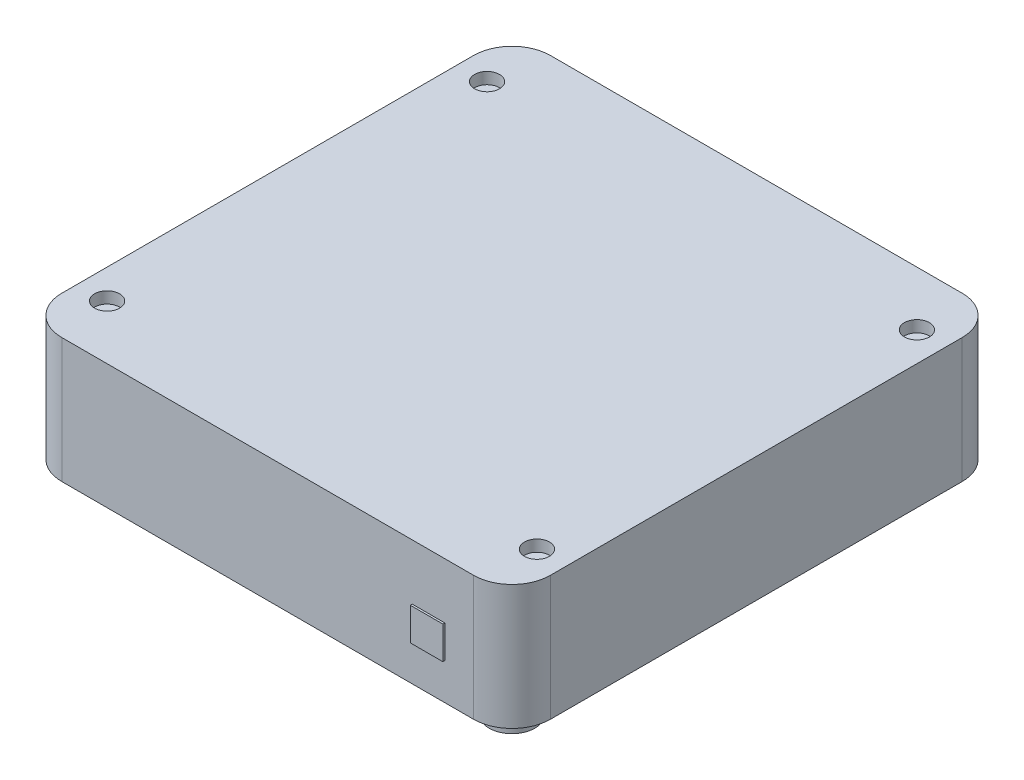
ISO-10303-21;
HEADER;
FILE_DESCRIPTION(('STEP AP214'),'2;1');
FILE_NAME('part.step','',(''),(''),'','','');
FILE_SCHEMA(('AUTOMOTIVE_DESIGN { 1 0 10303 214 1 1 1 1 }'));
ENDSEC;
DATA;
#1=APPLICATION_CONTEXT('core data for automotive mechanical design processes');
#2=APPLICATION_PROTOCOL_DEFINITION('international standard','automotive_design',2000,#1);
#3=PRODUCT_CONTEXT('',#1,'mechanical');
#4=PRODUCT('Part','Part','',(#3));
#5=PRODUCT_RELATED_PRODUCT_CATEGORY('part','',(#4));
#6=PRODUCT_DEFINITION_FORMATION('','',#4);
#7=PRODUCT_DEFINITION_CONTEXT('part definition',#1,'design');
#8=PRODUCT_DEFINITION('design','',#6,#7);
#9=PRODUCT_DEFINITION_SHAPE('','',#8);
#10=(LENGTH_UNIT() NAMED_UNIT(*) SI_UNIT(.MILLI.,.METRE.));
#11=(NAMED_UNIT(*) PLANE_ANGLE_UNIT() SI_UNIT($,.RADIAN.));
#12=(NAMED_UNIT(*) SI_UNIT($,.STERADIAN.) SOLID_ANGLE_UNIT());
#13=UNCERTAINTY_MEASURE_WITH_UNIT(LENGTH_MEASURE(1.E-05),#10,'distance_accuracy_value','');
#14=(GEOMETRIC_REPRESENTATION_CONTEXT(3) GLOBAL_UNCERTAINTY_ASSIGNED_CONTEXT((#13)) GLOBAL_UNIT_ASSIGNED_CONTEXT((#10,
#11,#12)) REPRESENTATION_CONTEXT('',''));
#15=CARTESIAN_POINT('',(0.,0.,0.));
#16=DIRECTION('',(0.,0.,1.));
#17=DIRECTION('',(1.,0.,0.));
#18=AXIS2_PLACEMENT_3D('',#15,#16,#17);
#19=CARTESIAN_POINT('',(-63.65,16.25,63.65));
#20=DIRECTION('',(0.,0.,-1.));
#21=DIRECTION('',(-1.,0.,0.));
#22=AXIS2_PLACEMENT_3D('',#19,#20,#21);
#23=PLANE('',#22);
#24=DIRECTION('',(1.,0.,0.));
#25=VECTOR('',#24,1.);
#26=CARTESIAN_POINT('',(-63.65,16.25,63.65));
#27=LINE('',#26,#25);
#28=CARTESIAN_POINT('',(-53.65,16.25,63.65));
#29=VERTEX_POINT('',#28);
#30=CARTESIAN_POINT('',(53.65,16.25,63.65));
#31=VERTEX_POINT('',#30);
#32=EDGE_CURVE('E186',#29,#31,#27,.T.);
#33=ORIENTED_EDGE('',*,*,#32,.F.);
#34=DIRECTION('',(0.,-1.,0.));
#35=VECTOR('',#34,1.);
#36=CARTESIAN_POINT('',(-53.65,16.25,63.65));
#37=LINE('',#36,#35);
#38=CARTESIAN_POINT('',(-53.65,-16.25,63.65));
#39=VERTEX_POINT('',#38);
#40=EDGE_CURVE('E223',#29,#39,#37,.T.);
#41=ORIENTED_EDGE('',*,*,#40,.T.);
#42=DIRECTION('',(1.,0.,0.));
#43=VECTOR('',#42,1.);
#44=CARTESIAN_POINT('',(-63.65,-16.25,63.65));
#45=LINE('',#44,#43);
#46=CARTESIAN_POINT('',(53.65,-16.25,63.65));
#47=VERTEX_POINT('',#46);
#48=EDGE_CURVE('E179',#39,#47,#45,.T.);
#49=ORIENTED_EDGE('',*,*,#48,.T.);
#50=DIRECTION('',(0.,-1.,0.));
#51=VECTOR('',#50,1.);
#52=CARTESIAN_POINT('',(53.65,16.25,63.65));
#53=LINE('',#52,#51);
#54=EDGE_CURVE('E220',#47,#31,#53,.F.);
#55=ORIENTED_EDGE('',*,*,#54,.T.);
#56=EDGE_LOOP('',(#33,#41,#49,#55));
#57=FACE_BOUND('',#56,.T.);
#58=DIRECTION('',(0.,-1.,0.));
#59=VECTOR('',#58,1.);
#60=CARTESIAN_POINT('',(37.65,16.25,63.65));
#61=LINE('',#60,#59);
#62=CARTESIAN_POINT('',(37.65,1.75,63.65));
#63=VERTEX_POINT('',#62);
#64=CARTESIAN_POINT('',(37.65,-6.75,63.65));
#65=VERTEX_POINT('',#64);
#66=EDGE_CURVE('E162',#63,#65,#61,.T.);
#67=ORIENTED_EDGE('',*,*,#66,.F.);
#68=DIRECTION('',(-1.,0.,0.));
#69=VECTOR('',#68,1.);
#70=CARTESIAN_POINT('',(-63.65,1.75,63.65));
#71=LINE('',#70,#69);
#72=CARTESIAN_POINT('',(46.15,1.75,63.65));
#73=VERTEX_POINT('',#72);
#74=EDGE_CURVE('E189',#73,#63,#71,.T.);
#75=ORIENTED_EDGE('',*,*,#74,.F.);
#76=DIRECTION('',(0.,1.,0.));
#77=VECTOR('',#76,1.);
#78=CARTESIAN_POINT('',(46.15,16.25,63.65));
#79=LINE('',#78,#77);
#80=CARTESIAN_POINT('',(46.15,-6.75,63.65));
#81=VERTEX_POINT('',#80);
#82=EDGE_CURVE('E203',#81,#73,#79,.T.);
#83=ORIENTED_EDGE('',*,*,#82,.F.);
#84=DIRECTION('',(1.,0.,0.));
#85=VECTOR('',#84,1.);
#86=CARTESIAN_POINT('',(-63.65,-6.75,63.65));
#87=LINE('',#86,#85);
#88=EDGE_CURVE('E207',#65,#81,#87,.T.);
#89=ORIENTED_EDGE('',*,*,#88,.F.);
#90=EDGE_LOOP('',(#67,#75,#83,#89));
#91=FACE_BOUND('',#90,.T.);
#92=ADVANCED_FACE('F45',(#57,#91),#23,.F.);
#93=CARTESIAN_POINT('',(63.65,16.25,-63.65));
#94=DIRECTION('',(-1.,0.,0.));
#95=DIRECTION('',(0.,0.,1.));
#96=AXIS2_PLACEMENT_3D('',#93,#94,#95);
#97=PLANE('',#96);
#98=DIRECTION('',(0.,0.,-1.));
#99=VECTOR('',#98,1.);
#100=CARTESIAN_POINT('',(63.65,-16.25,-63.65));
#101=LINE('',#100,#99);
#102=CARTESIAN_POINT('',(63.65,-16.25,53.65));
#103=VERTEX_POINT('',#102);
#104=CARTESIAN_POINT('',(63.65,-16.25,-53.65));
#105=VERTEX_POINT('',#104);
#106=EDGE_CURVE('E164',#103,#105,#101,.T.);
#107=ORIENTED_EDGE('',*,*,#106,.T.);
#108=DIRECTION('',(0.,-1.,0.));
#109=VECTOR('',#108,1.);
#110=CARTESIAN_POINT('',(63.65,16.25,-53.65));
#111=LINE('',#110,#109);
#112=CARTESIAN_POINT('',(63.65,16.25,-53.65));
#113=VERTEX_POINT('',#112);
#114=EDGE_CURVE('E11',#105,#113,#111,.F.);
#115=ORIENTED_EDGE('',*,*,#114,.T.);
#116=DIRECTION('',(0.,0.,-1.));
#117=VECTOR('',#116,1.);
#118=CARTESIAN_POINT('',(63.65,16.25,-63.65));
#119=LINE('',#118,#117);
#120=CARTESIAN_POINT('',(63.65,16.25,53.65));
#121=VERTEX_POINT('',#120);
#122=EDGE_CURVE('E175',#121,#113,#119,.T.);
#123=ORIENTED_EDGE('',*,*,#122,.F.);
#124=DIRECTION('',(0.,-1.,0.));
#125=VECTOR('',#124,1.);
#126=CARTESIAN_POINT('',(63.65,16.25,53.65));
#127=LINE('',#126,#125);
#128=EDGE_CURVE('E54',#121,#103,#127,.T.);
#129=ORIENTED_EDGE('',*,*,#128,.T.);
#130=EDGE_LOOP('',(#107,#115,#123,#129));
#131=FACE_BOUND('',#130,.T.);
#132=ADVANCED_FACE('F268',(#131),#97,.F.);
#133=CARTESIAN_POINT('',(-63.65,16.25,-63.65));
#134=DIRECTION('',(0.,0.,1.));
#135=DIRECTION('',(1.,0.,0.));
#136=AXIS2_PLACEMENT_3D('',#133,#134,#135);
#137=PLANE('',#136);
#138=DIRECTION('',(-1.,0.,0.));
#139=VECTOR('',#138,1.);
#140=CARTESIAN_POINT('',(-63.65,-16.25,-63.65));
#141=LINE('',#140,#139);
#142=CARTESIAN_POINT('',(53.65,-16.25,-63.65));
#143=VERTEX_POINT('',#142);
#144=CARTESIAN_POINT('',(-53.65,-16.25,-63.65));
#145=VERTEX_POINT('',#144);
#146=EDGE_CURVE('E169',#143,#145,#141,.T.);
#147=ORIENTED_EDGE('',*,*,#146,.T.);
#148=DIRECTION('',(0.,-1.,0.));
#149=VECTOR('',#148,1.);
#150=CARTESIAN_POINT('',(-53.65,16.25,-63.65));
#151=LINE('',#150,#149);
#152=CARTESIAN_POINT('',(-53.65,16.25,-63.65));
#153=VERTEX_POINT('',#152);
#154=EDGE_CURVE('E61',#145,#153,#151,.F.);
#155=ORIENTED_EDGE('',*,*,#154,.T.);
#156=DIRECTION('',(-1.,0.,0.));
#157=VECTOR('',#156,1.);
#158=CARTESIAN_POINT('',(-63.65,16.25,-63.65));
#159=LINE('',#158,#157);
#160=CARTESIAN_POINT('',(53.65,16.25,-63.65));
#161=VERTEX_POINT('',#160);
#162=EDGE_CURVE('E178',#161,#153,#159,.T.);
#163=ORIENTED_EDGE('',*,*,#162,.F.);
#164=DIRECTION('',(0.,-1.,0.));
#165=VECTOR('',#164,1.);
#166=CARTESIAN_POINT('',(53.65,16.25,-63.65));
#167=LINE('',#166,#165);
#168=EDGE_CURVE('E257',#161,#143,#167,.T.);
#169=ORIENTED_EDGE('',*,*,#168,.T.);
#170=EDGE_LOOP('',(#147,#155,#163,#169));
#171=FACE_BOUND('',#170,.T.);
#172=ADVANCED_FACE('F279',(#171),#137,.F.);
#173=CARTESIAN_POINT('',(-63.65,16.25,-63.65));
#174=DIRECTION('',(1.,0.,0.));
#175=DIRECTION('',(0.,0.,-1.));
#176=AXIS2_PLACEMENT_3D('',#173,#174,#175);
#177=PLANE('',#176);
#178=DIRECTION('',(0.,0.,1.));
#179=VECTOR('',#178,1.);
#180=CARTESIAN_POINT('',(-63.65,-16.25,-63.65));
#181=LINE('',#180,#179);
#182=CARTESIAN_POINT('',(-63.65,-16.25,-53.65));
#183=VERTEX_POINT('',#182);
#184=CARTESIAN_POINT('',(-63.65,-16.25,53.65));
#185=VERTEX_POINT('',#184);
#186=EDGE_CURVE('E193',#183,#185,#181,.T.);
#187=ORIENTED_EDGE('',*,*,#186,.T.);
#188=DIRECTION('',(0.,-1.,0.));
#189=VECTOR('',#188,1.);
#190=CARTESIAN_POINT('',(-63.65,16.25,53.65));
#191=LINE('',#190,#189);
#192=CARTESIAN_POINT('',(-63.65,16.25,53.65));
#193=VERTEX_POINT('',#192);
#194=EDGE_CURVE('E243',#185,#193,#191,.F.);
#195=ORIENTED_EDGE('',*,*,#194,.T.);
#196=DIRECTION('',(0.,0.,1.));
#197=VECTOR('',#196,1.);
#198=CARTESIAN_POINT('',(-63.65,16.25,-63.65));
#199=LINE('',#198,#197);
#200=CARTESIAN_POINT('',(-63.65,16.25,-53.65));
#201=VERTEX_POINT('',#200);
#202=EDGE_CURVE('E182',#201,#193,#199,.T.);
#203=ORIENTED_EDGE('',*,*,#202,.F.);
#204=DIRECTION('',(0.,-1.,0.));
#205=VECTOR('',#204,1.);
#206=CARTESIAN_POINT('',(-63.65,16.25,-53.65));
#207=LINE('',#206,#205);
#208=EDGE_CURVE('E239',#201,#183,#207,.T.);
#209=ORIENTED_EDGE('',*,*,#208,.T.);
#210=EDGE_LOOP('',(#187,#195,#203,#209));
#211=FACE_BOUND('',#210,.T.);
#212=ADVANCED_FACE('F288',(#211),#177,.F.);
#213=CARTESIAN_POINT('',(0.,16.25,0.));
#214=DIRECTION('',(0.,1.,0.));
#215=DIRECTION('',(0.,0.,1.));
#216=AXIS2_PLACEMENT_3D('',#213,#214,#215);
#217=PLANE('',#216);
#218=CARTESIAN_POINT('',(-56.,16.25,49.5));
#219=DIRECTION('',(0.,1.,0.));
#220=DIRECTION('',(0.,0.,-1.));
#221=AXIS2_PLACEMENT_3D('',#218,#219,#220);
#222=CIRCLE('',#221,3.25);
#223=CARTESIAN_POINT('',(-56.,16.25,46.25));
#224=VERTEX_POINT('',#223);
#225=EDGE_CURVE('E463',#224,#224,#222,.T.);
#226=ORIENTED_EDGE('',*,*,#225,.F.);
#227=EDGE_LOOP('',(#226));
#228=FACE_BOUND('',#227,.T.);
#229=CARTESIAN_POINT('',(56.,16.25,49.5));
#230=DIRECTION('',(0.,-1.,0.));
#231=DIRECTION('',(0.,0.,-1.));
#232=AXIS2_PLACEMENT_3D('',#229,#230,#231);
#233=CIRCLE('',#232,3.25);
#234=CARTESIAN_POINT('',(56.,16.25,46.25));
#235=VERTEX_POINT('',#234);
#236=EDGE_CURVE('E467',#235,#235,#233,.T.);
#237=ORIENTED_EDGE('',*,*,#236,.T.);
#238=EDGE_LOOP('',(#237));
#239=FACE_BOUND('',#238,.T.);
#240=CARTESIAN_POINT('',(-56.,16.25,-49.5));
#241=DIRECTION('',(0.,-1.,0.));
#242=DIRECTION('',(0.,0.,1.));
#243=AXIS2_PLACEMENT_3D('',#240,#241,#242);
#244=CIRCLE('',#243,3.25);
#245=CARTESIAN_POINT('',(-56.,16.25,-46.25));
#246=VERTEX_POINT('',#245);
#247=EDGE_CURVE('E471',#246,#246,#244,.T.);
#248=ORIENTED_EDGE('',*,*,#247,.T.);
#249=EDGE_LOOP('',(#248));
#250=FACE_BOUND('',#249,.T.);
#251=CARTESIAN_POINT('',(56.,16.25,-49.5));
#252=DIRECTION('',(0.,1.,0.));
#253=DIRECTION('',(0.,0.,1.));
#254=AXIS2_PLACEMENT_3D('',#251,#252,#253);
#255=CIRCLE('',#254,3.25);
#256=CARTESIAN_POINT('',(56.,16.25,-46.25));
#257=VERTEX_POINT('',#256);
#258=EDGE_CURVE('E474',#257,#257,#255,.T.);
#259=ORIENTED_EDGE('',*,*,#258,.F.);
#260=EDGE_LOOP('',(#259));
#261=FACE_BOUND('',#260,.T.);
#262=ORIENTED_EDGE('',*,*,#202,.T.);
#263=CARTESIAN_POINT('',(-53.65,16.25,53.65));
#264=DIRECTION('',(0.,1.,0.));
#265=DIRECTION('',(0.,0.,1.));
#266=AXIS2_PLACEMENT_3D('',#263,#264,#265);
#267=CIRCLE('',#266,10.);
#268=EDGE_CURVE('E254',#193,#29,#267,.T.);
#269=ORIENTED_EDGE('',*,*,#268,.T.);
#270=ORIENTED_EDGE('',*,*,#32,.T.);
#271=CARTESIAN_POINT('',(53.65,16.25,53.65));
#272=DIRECTION('',(0.,1.,0.));
#273=DIRECTION('',(0.,0.,1.));
#274=AXIS2_PLACEMENT_3D('',#271,#272,#273);
#275=CIRCLE('',#274,10.);
#276=EDGE_CURVE('E246',#31,#121,#275,.T.);
#277=ORIENTED_EDGE('',*,*,#276,.T.);
#278=ORIENTED_EDGE('',*,*,#122,.T.);
#279=CARTESIAN_POINT('',(53.65,16.25,-53.65));
#280=DIRECTION('',(0.,1.,0.));
#281=DIRECTION('',(0.,0.,1.));
#282=AXIS2_PLACEMENT_3D('',#279,#280,#281);
#283=CIRCLE('',#282,10.);
#284=EDGE_CURVE('E68',#113,#161,#283,.T.);
#285=ORIENTED_EDGE('',*,*,#284,.T.);
#286=ORIENTED_EDGE('',*,*,#162,.T.);
#287=CARTESIAN_POINT('',(-53.65,16.25,-53.65));
#288=DIRECTION('',(0.,1.,0.));
#289=DIRECTION('',(0.,0.,1.));
#290=AXIS2_PLACEMENT_3D('',#287,#288,#289);
#291=CIRCLE('',#290,10.);
#292=EDGE_CURVE('E251',#153,#201,#291,.T.);
#293=ORIENTED_EDGE('',*,*,#292,.T.);
#294=EDGE_LOOP('',(#262,#269,#270,#277,#278,#285,#286,#293));
#295=FACE_BOUND('',#294,.T.);
#296=ADVANCED_FACE('F281',(#228,#239,#250,#261,#295),#217,.T.);
#297=CARTESIAN_POINT('',(0.,-16.25,0.));
#298=DIRECTION('',(0.,1.,0.));
#299=DIRECTION('',(0.,0.,1.));
#300=AXIS2_PLACEMENT_3D('',#297,#298,#299);
#301=PLANE('',#300);
#302=CARTESIAN_POINT('',(-48.,-16.25,0.));
#303=DIRECTION('',(0.,-1.,0.));
#304=DIRECTION('',(0.,0.,-1.));
#305=AXIS2_PLACEMENT_3D('',#302,#303,#304);
#306=CIRCLE('',#305,1.6);
#307=CARTESIAN_POINT('',(-48.,-16.25,-1.6));
#308=VERTEX_POINT('',#307);
#309=EDGE_CURVE('E559',#308,#308,#306,.T.);
#310=ORIENTED_EDGE('',*,*,#309,.F.);
#311=EDGE_LOOP('',(#310));
#312=FACE_BOUND('',#311,.T.);
#313=CARTESIAN_POINT('',(48.,-16.25,0.));
#314=DIRECTION('',(0.,-1.,0.));
#315=DIRECTION('',(0.,0.,-1.));
#316=AXIS2_PLACEMENT_3D('',#313,#314,#315);
#317=CIRCLE('',#316,1.6);
#318=CARTESIAN_POINT('',(48.,-16.25,-1.59999999999998));
#319=VERTEX_POINT('',#318);
#320=EDGE_CURVE('E555',#319,#319,#317,.T.);
#321=ORIENTED_EDGE('',*,*,#320,.F.);
#322=EDGE_LOOP('',(#321));
#323=FACE_BOUND('',#322,.T.);
#324=CARTESIAN_POINT('',(-51.65,-16.25,-51.65));
#325=DIRECTION('',(0.,1.,0.));
#326=DIRECTION('',(0.,0.,1.));
#327=AXIS2_PLACEMENT_3D('',#324,#325,#326);
#328=CIRCLE('',#327,5.99999999999999);
#329=CARTESIAN_POINT('',(-51.65,-16.25,-45.65));
#330=VERTEX_POINT('',#329);
#331=EDGE_CURVE('E216',#330,#330,#328,.F.);
#332=ORIENTED_EDGE('',*,*,#331,.F.);
#333=EDGE_LOOP('',(#332));
#334=FACE_BOUND('',#333,.T.);
#335=CARTESIAN_POINT('',(-51.65,-16.25,51.65));
#336=DIRECTION('',(0.,1.,0.));
#337=DIRECTION('',(0.,0.,-1.));
#338=AXIS2_PLACEMENT_3D('',#335,#336,#337);
#339=CIRCLE('',#338,5.99999999999999);
#340=CARTESIAN_POINT('',(-51.65,-16.25,45.65));
#341=VERTEX_POINT('',#340);
#342=EDGE_CURVE('E492',#341,#341,#339,.T.);
#343=ORIENTED_EDGE('',*,*,#342,.T.);
#344=EDGE_LOOP('',(#343));
#345=FACE_BOUND('',#344,.T.);
#346=CARTESIAN_POINT('',(51.65,-16.25,-51.65));
#347=DIRECTION('',(0.,1.,0.));
#348=DIRECTION('',(0.,0.,1.));
#349=AXIS2_PLACEMENT_3D('',#346,#347,#348);
#350=CIRCLE('',#349,5.99999999999999);
#351=CARTESIAN_POINT('',(51.65,-16.25,-45.65));
#352=VERTEX_POINT('',#351);
#353=EDGE_CURVE('E497',#352,#352,#350,.T.);
#354=ORIENTED_EDGE('',*,*,#353,.T.);
#355=EDGE_LOOP('',(#354));
#356=FACE_BOUND('',#355,.T.);
#357=CARTESIAN_POINT('',(51.65,-16.25,51.65));
#358=DIRECTION('',(0.,1.,0.));
#359=DIRECTION('',(0.,0.,1.));
#360=AXIS2_PLACEMENT_3D('',#357,#358,#359);
#361=CIRCLE('',#360,5.99999999999999);
#362=CARTESIAN_POINT('',(51.65,-16.25,57.65));
#363=VERTEX_POINT('',#362);
#364=EDGE_CURVE('E212',#363,#363,#361,.F.);
#365=ORIENTED_EDGE('',*,*,#364,.F.);
#366=EDGE_LOOP('',(#365));
#367=FACE_BOUND('',#366,.T.);
#368=ORIENTED_EDGE('',*,*,#48,.F.);
#369=CARTESIAN_POINT('',(-53.65,-16.25,53.65));
#370=DIRECTION('',(0.,1.,0.));
#371=DIRECTION('',(0.,0.,1.));
#372=AXIS2_PLACEMENT_3D('',#369,#370,#371);
#373=CIRCLE('',#372,10.);
#374=EDGE_CURVE('E236',#39,#185,#373,.F.);
#375=ORIENTED_EDGE('',*,*,#374,.T.);
#376=ORIENTED_EDGE('',*,*,#186,.F.);
#377=CARTESIAN_POINT('',(-53.65,-16.25,-53.65));
#378=DIRECTION('',(0.,1.,0.));
#379=DIRECTION('',(0.,0.,1.));
#380=AXIS2_PLACEMENT_3D('',#377,#378,#379);
#381=CIRCLE('',#380,10.);
#382=EDGE_CURVE('E233',#183,#145,#381,.F.);
#383=ORIENTED_EDGE('',*,*,#382,.T.);
#384=ORIENTED_EDGE('',*,*,#146,.F.);
#385=CARTESIAN_POINT('',(53.65,-16.25,-53.65));
#386=DIRECTION('',(0.,1.,0.));
#387=DIRECTION('',(0.,0.,1.));
#388=AXIS2_PLACEMENT_3D('',#385,#386,#387);
#389=CIRCLE('',#388,10.);
#390=EDGE_CURVE('E230',#143,#105,#389,.F.);
#391=ORIENTED_EDGE('',*,*,#390,.T.);
#392=ORIENTED_EDGE('',*,*,#106,.F.);
#393=CARTESIAN_POINT('',(53.65,-16.25,53.65));
#394=DIRECTION('',(0.,1.,0.));
#395=DIRECTION('',(0.,0.,1.));
#396=AXIS2_PLACEMENT_3D('',#393,#394,#395);
#397=CIRCLE('',#396,10.);
#398=EDGE_CURVE('E227',#103,#47,#397,.F.);
#399=ORIENTED_EDGE('',*,*,#398,.T.);
#400=EDGE_LOOP('',(#368,#375,#376,#383,#384,#391,#392,#399));
#401=FACE_BOUND('',#400,.T.);
#402=ADVANCED_FACE('F274',(#312,#323,#334,#345,#356,#367,#401),#301,.F.);
#403=CARTESIAN_POINT('',(37.65,1.75,64.15));
#404=DIRECTION('',(1.,0.,0.));
#405=DIRECTION('',(0.,0.,-1.));
#406=AXIS2_PLACEMENT_3D('',#403,#404,#405);
#407=PLANE('',#406);
#408=DIRECTION('',(0.,0.,-1.));
#409=VECTOR('',#408,1.);
#410=CARTESIAN_POINT('',(37.65,1.75,64.15));
#411=LINE('',#410,#409);
#412=CARTESIAN_POINT('',(37.65,1.75,64.15));
#413=VERTEX_POINT('',#412);
#414=EDGE_CURVE('E515',#413,#63,#411,.T.);
#415=ORIENTED_EDGE('',*,*,#414,.T.);
#416=ORIENTED_EDGE('',*,*,#66,.T.);
#417=DIRECTION('',(0.,0.,-1.));
#418=VECTOR('',#417,1.);
#419=CARTESIAN_POINT('',(37.65,-6.75,64.15));
#420=LINE('',#419,#418);
#421=CARTESIAN_POINT('',(37.65,-6.75,64.15));
#422=VERTEX_POINT('',#421);
#423=EDGE_CURVE('E141',#422,#65,#420,.T.);
#424=ORIENTED_EDGE('',*,*,#423,.F.);
#425=DIRECTION('',(0.,-1.,0.));
#426=VECTOR('',#425,1.);
#427=CARTESIAN_POINT('',(37.65,1.75,64.15));
#428=LINE('',#427,#426);
#429=EDGE_CURVE('E148',#413,#422,#428,.T.);
#430=ORIENTED_EDGE('',*,*,#429,.F.);
#431=EDGE_LOOP('',(#415,#416,#424,#430));
#432=FACE_BOUND('',#431,.T.);
#433=ADVANCED_FACE('F161',(#432),#407,.F.);
#434=CARTESIAN_POINT('',(37.65,-6.75,64.15));
#435=DIRECTION('',(0.,1.,0.));
#436=DIRECTION('',(0.,0.,1.));
#437=AXIS2_PLACEMENT_3D('',#434,#435,#436);
#438=PLANE('',#437);
#439=ORIENTED_EDGE('',*,*,#423,.T.);
#440=ORIENTED_EDGE('',*,*,#88,.T.);
#441=DIRECTION('',(0.,0.,-1.));
#442=VECTOR('',#441,1.);
#443=CARTESIAN_POINT('',(46.15,-6.75,64.15));
#444=LINE('',#443,#442);
#445=CARTESIAN_POINT('',(46.15,-6.75,64.15));
#446=VERTEX_POINT('',#445);
#447=EDGE_CURVE('E143',#446,#81,#444,.T.);
#448=ORIENTED_EDGE('',*,*,#447,.F.);
#449=DIRECTION('',(1.,0.,0.));
#450=VECTOR('',#449,1.);
#451=CARTESIAN_POINT('',(37.65,-6.75,64.15));
#452=LINE('',#451,#450);
#453=EDGE_CURVE('E136',#422,#446,#452,.T.);
#454=ORIENTED_EDGE('',*,*,#453,.F.);
#455=EDGE_LOOP('',(#439,#440,#448,#454));
#456=FACE_BOUND('',#455,.T.);
#457=ADVANCED_FACE('F138',(#456),#438,.F.);
#458=CARTESIAN_POINT('',(46.15,1.75,64.15));
#459=DIRECTION('',(-1.,0.,0.));
#460=DIRECTION('',(0.,0.,1.));
#461=AXIS2_PLACEMENT_3D('',#458,#459,#460);
#462=PLANE('',#461);
#463=ORIENTED_EDGE('',*,*,#447,.T.);
#464=ORIENTED_EDGE('',*,*,#82,.T.);
#465=DIRECTION('',(0.,0.,-1.));
#466=VECTOR('',#465,1.);
#467=CARTESIAN_POINT('',(46.15,1.75,64.15));
#468=LINE('',#467,#466);
#469=CARTESIAN_POINT('',(46.15,1.75,64.15));
#470=VERTEX_POINT('',#469);
#471=EDGE_CURVE('E171',#470,#73,#468,.T.);
#472=ORIENTED_EDGE('',*,*,#471,.F.);
#473=DIRECTION('',(0.,1.,0.));
#474=VECTOR('',#473,1.);
#475=CARTESIAN_POINT('',(46.15,1.75,64.15));
#476=LINE('',#475,#474);
#477=EDGE_CURVE('E147',#446,#470,#476,.T.);
#478=ORIENTED_EDGE('',*,*,#477,.F.);
#479=EDGE_LOOP('',(#463,#464,#472,#478));
#480=FACE_BOUND('',#479,.T.);
#481=ADVANCED_FACE('F448',(#480),#462,.F.);
#482=CARTESIAN_POINT('',(37.65,1.75,64.15));
#483=DIRECTION('',(0.,-1.,0.));
#484=DIRECTION('',(0.,0.,-1.));
#485=AXIS2_PLACEMENT_3D('',#482,#483,#484);
#486=PLANE('',#485);
#487=ORIENTED_EDGE('',*,*,#471,.T.);
#488=ORIENTED_EDGE('',*,*,#74,.T.);
#489=ORIENTED_EDGE('',*,*,#414,.F.);
#490=DIRECTION('',(-1.,0.,0.));
#491=VECTOR('',#490,1.);
#492=CARTESIAN_POINT('',(37.65,1.75,64.15));
#493=LINE('',#492,#491);
#494=EDGE_CURVE('E153',#470,#413,#493,.T.);
#495=ORIENTED_EDGE('',*,*,#494,.F.);
#496=EDGE_LOOP('',(#487,#488,#489,#495));
#497=FACE_BOUND('',#496,.T.);
#498=ADVANCED_FACE('F445',(#497),#486,.F.);
#499=CARTESIAN_POINT('',(0.,0.,64.15));
#500=DIRECTION('',(0.,0.,1.));
#501=DIRECTION('',(1.,0.,0.));
#502=AXIS2_PLACEMENT_3D('',#499,#500,#501);
#503=PLANE('',#502);
#504=ORIENTED_EDGE('',*,*,#429,.T.);
#505=ORIENTED_EDGE('',*,*,#453,.T.);
#506=ORIENTED_EDGE('',*,*,#477,.T.);
#507=ORIENTED_EDGE('',*,*,#494,.T.);
#508=EDGE_LOOP('',(#504,#505,#506,#507));
#509=FACE_BOUND('',#508,.T.);
#510=ADVANCED_FACE('F151',(#509),#503,.T.);
#511=CARTESIAN_POINT('',(51.65,-22.25,51.65));
#512=DIRECTION('',(0.,1.,0.));
#513=DIRECTION('',(0.,0.,1.));
#514=AXIS2_PLACEMENT_3D('',#511,#512,#513);
#515=CYLINDRICAL_SURFACE('',#514,5.99999999999999);
#516=CARTESIAN_POINT('',(51.65,-22.25,51.65));
#517=DIRECTION('',(0.,-1.,0.));
#518=DIRECTION('',(0.,0.,-1.));
#519=AXIS2_PLACEMENT_3D('',#516,#517,#518);
#520=CIRCLE('',#519,5.99999999999999);
#521=CARTESIAN_POINT('',(51.65,-22.25,45.65));
#522=VERTEX_POINT('',#521);
#523=EDGE_CURVE('E158',#522,#522,#520,.T.);
#524=ORIENTED_EDGE('',*,*,#523,.F.);
#525=EDGE_LOOP('',(#524));
#526=FACE_BOUND('',#525,.T.);
#527=ORIENTED_EDGE('',*,*,#364,.T.);
#528=EDGE_LOOP('',(#527));
#529=FACE_BOUND('',#528,.T.);
#530=ADVANCED_FACE('F438',(#526,#529),#515,.T.);
#531=CARTESIAN_POINT('',(51.65,-22.25,51.65));
#532=DIRECTION('',(0.,-1.,0.));
#533=DIRECTION('',(0.,0.,-1.));
#534=AXIS2_PLACEMENT_3D('',#531,#532,#533);
#535=PLANE('',#534);
#536=ORIENTED_EDGE('',*,*,#523,.T.);
#537=EDGE_LOOP('',(#536));
#538=FACE_BOUND('',#537,.T.);
#539=ADVANCED_FACE('F434',(#538),#535,.T.);
#540=CARTESIAN_POINT('',(51.65,-22.25,-51.65));
#541=DIRECTION('',(0.,1.,0.));
#542=DIRECTION('',(0.,0.,1.));
#543=AXIS2_PLACEMENT_3D('',#540,#541,#542);
#544=CYLINDRICAL_SURFACE('',#543,5.99999999999999);
#545=CARTESIAN_POINT('',(51.65,-22.25,-51.65));
#546=DIRECTION('',(0.,1.,0.));
#547=DIRECTION('',(0.,0.,1.));
#548=AXIS2_PLACEMENT_3D('',#545,#546,#547);
#549=CIRCLE('',#548,5.99999999999999);
#550=CARTESIAN_POINT('',(51.65,-22.25,-45.65));
#551=VERTEX_POINT('',#550);
#552=EDGE_CURVE('E501',#551,#551,#549,.T.);
#553=ORIENTED_EDGE('',*,*,#552,.T.);
#554=EDGE_LOOP('',(#553));
#555=FACE_BOUND('',#554,.T.);
#556=ORIENTED_EDGE('',*,*,#353,.F.);
#557=EDGE_LOOP('',(#556));
#558=FACE_BOUND('',#557,.T.);
#559=ADVANCED_FACE('F430',(#555,#558),#544,.T.);
#560=CARTESIAN_POINT('',(51.65,-22.25,-51.65));
#561=DIRECTION('',(0.,-1.,0.));
#562=DIRECTION('',(0.,0.,1.));
#563=AXIS2_PLACEMENT_3D('',#560,#561,#562);
#564=PLANE('',#563);
#565=ORIENTED_EDGE('',*,*,#552,.F.);
#566=EDGE_LOOP('',(#565));
#567=FACE_BOUND('',#566,.T.);
#568=ADVANCED_FACE('F426',(#567),#564,.T.);
#569=CARTESIAN_POINT('',(-51.65,-22.25,51.65));
#570=DIRECTION('',(0.,1.,0.));
#571=DIRECTION('',(0.,0.,1.));
#572=AXIS2_PLACEMENT_3D('',#569,#570,#571);
#573=CYLINDRICAL_SURFACE('',#572,5.99999999999999);
#574=CARTESIAN_POINT('',(-51.65,-22.25,51.65));
#575=DIRECTION('',(0.,1.,0.));
#576=DIRECTION('',(0.,0.,-1.));
#577=AXIS2_PLACEMENT_3D('',#574,#575,#576);
#578=CIRCLE('',#577,5.99999999999999);
#579=CARTESIAN_POINT('',(-51.65,-22.25,45.65));
#580=VERTEX_POINT('',#579);
#581=EDGE_CURVE('E493',#580,#580,#578,.T.);
#582=ORIENTED_EDGE('',*,*,#581,.T.);
#583=EDGE_LOOP('',(#582));
#584=FACE_BOUND('',#583,.T.);
#585=ORIENTED_EDGE('',*,*,#342,.F.);
#586=EDGE_LOOP('',(#585));
#587=FACE_BOUND('',#586,.T.);
#588=ADVANCED_FACE('F422',(#584,#587),#573,.T.);
#589=CARTESIAN_POINT('',(-51.65,-22.25,51.65));
#590=DIRECTION('',(0.,-1.,0.));
#591=DIRECTION('',(0.,0.,-1.));
#592=AXIS2_PLACEMENT_3D('',#589,#590,#591);
#593=PLANE('',#592);
#594=ORIENTED_EDGE('',*,*,#581,.F.);
#595=EDGE_LOOP('',(#594));
#596=FACE_BOUND('',#595,.T.);
#597=ADVANCED_FACE('F418',(#596),#593,.T.);
#598=CARTESIAN_POINT('',(-51.65,-22.25,-51.65));
#599=DIRECTION('',(0.,1.,0.));
#600=DIRECTION('',(0.,0.,1.));
#601=AXIS2_PLACEMENT_3D('',#598,#599,#600);
#602=CYLINDRICAL_SURFACE('',#601,5.99999999999999);
#603=CARTESIAN_POINT('',(-51.65,-22.25,-51.65));
#604=DIRECTION('',(0.,-1.,0.));
#605=DIRECTION('',(0.,0.,1.));
#606=AXIS2_PLACEMENT_3D('',#603,#604,#605);
#607=CIRCLE('',#606,5.99999999999999);
#608=CARTESIAN_POINT('',(-51.65,-22.25,-45.65));
#609=VERTEX_POINT('',#608);
#610=EDGE_CURVE('E483',#609,#609,#607,.T.);
#611=ORIENTED_EDGE('',*,*,#610,.F.);
#612=EDGE_LOOP('',(#611));
#613=FACE_BOUND('',#612,.T.);
#614=ORIENTED_EDGE('',*,*,#331,.T.);
#615=EDGE_LOOP('',(#614));
#616=FACE_BOUND('',#615,.T.);
#617=ADVANCED_FACE('F414',(#613,#616),#602,.T.);
#618=CARTESIAN_POINT('',(-51.65,-22.25,-51.65));
#619=DIRECTION('',(0.,-1.,0.));
#620=DIRECTION('',(0.,0.,1.));
#621=AXIS2_PLACEMENT_3D('',#618,#619,#620);
#622=PLANE('',#621);
#623=ORIENTED_EDGE('',*,*,#610,.T.);
#624=EDGE_LOOP('',(#623));
#625=FACE_BOUND('',#624,.T.);
#626=ADVANCED_FACE('F410',(#625),#622,.T.);
#627=CARTESIAN_POINT('',(56.,13.25,-49.5));
#628=DIRECTION('',(0.,1.,0.));
#629=DIRECTION('',(0.,0.,1.));
#630=AXIS2_PLACEMENT_3D('',#627,#628,#629);
#631=CYLINDRICAL_SURFACE('',#630,3.25);
#632=CARTESIAN_POINT('',(56.,13.25,-49.5));
#633=DIRECTION('',(0.,1.,0.));
#634=DIRECTION('',(0.,0.,1.));
#635=AXIS2_PLACEMENT_3D('',#632,#633,#634);
#636=CIRCLE('',#635,3.25);
#637=CARTESIAN_POINT('',(56.,13.25,-46.25));
#638=VERTEX_POINT('',#637);
#639=EDGE_CURVE('E477',#638,#638,#636,.T.);
#640=ORIENTED_EDGE('',*,*,#639,.F.);
#641=EDGE_LOOP('',(#640));
#642=FACE_BOUND('',#641,.T.);
#643=ORIENTED_EDGE('',*,*,#258,.T.);
#644=EDGE_LOOP('',(#643));
#645=FACE_BOUND('',#644,.T.);
#646=ADVANCED_FACE('F406',(#642,#645),#631,.F.);
#647=CARTESIAN_POINT('',(56.,13.25,-49.5));
#648=DIRECTION('',(0.,1.,0.));
#649=DIRECTION('',(0.,0.,1.));
#650=AXIS2_PLACEMENT_3D('',#647,#648,#649);
#651=PLANE('',#650);
#652=ORIENTED_EDGE('',*,*,#639,.T.);
#653=EDGE_LOOP('',(#652));
#654=FACE_BOUND('',#653,.T.);
#655=ADVANCED_FACE('F402',(#654),#651,.T.);
#656=CARTESIAN_POINT('',(-56.,13.25,-49.5));
#657=DIRECTION('',(0.,1.,0.));
#658=DIRECTION('',(0.,0.,1.));
#659=AXIS2_PLACEMENT_3D('',#656,#657,#658);
#660=CYLINDRICAL_SURFACE('',#659,3.25);
#661=CARTESIAN_POINT('',(-56.,13.25,-49.5));
#662=DIRECTION('',(0.,-1.,0.));
#663=DIRECTION('',(0.,0.,1.));
#664=AXIS2_PLACEMENT_3D('',#661,#662,#663);
#665=CIRCLE('',#664,3.25);
#666=CARTESIAN_POINT('',(-56.,13.25,-46.25));
#667=VERTEX_POINT('',#666);
#668=EDGE_CURVE('E478',#667,#667,#665,.T.);
#669=ORIENTED_EDGE('',*,*,#668,.T.);
#670=EDGE_LOOP('',(#669));
#671=FACE_BOUND('',#670,.T.);
#672=ORIENTED_EDGE('',*,*,#247,.F.);
#673=EDGE_LOOP('',(#672));
#674=FACE_BOUND('',#673,.T.);
#675=ADVANCED_FACE('F398',(#671,#674),#660,.F.);
#676=CARTESIAN_POINT('',(-56.,13.25,-49.5));
#677=DIRECTION('',(0.,1.,0.));
#678=DIRECTION('',(0.,0.,1.));
#679=AXIS2_PLACEMENT_3D('',#676,#677,#678);
#680=PLANE('',#679);
#681=ORIENTED_EDGE('',*,*,#668,.F.);
#682=EDGE_LOOP('',(#681));
#683=FACE_BOUND('',#682,.T.);
#684=ADVANCED_FACE('F394',(#683),#680,.T.);
#685=CARTESIAN_POINT('',(56.,13.25,49.5));
#686=DIRECTION('',(0.,1.,0.));
#687=DIRECTION('',(0.,0.,1.));
#688=AXIS2_PLACEMENT_3D('',#685,#686,#687);
#689=CYLINDRICAL_SURFACE('',#688,3.25);
#690=CARTESIAN_POINT('',(56.,13.25,49.5));
#691=DIRECTION('',(0.,-1.,0.));
#692=DIRECTION('',(0.,0.,-1.));
#693=AXIS2_PLACEMENT_3D('',#690,#691,#692);
#694=CIRCLE('',#693,3.25);
#695=CARTESIAN_POINT('',(56.,13.25,46.25));
#696=VERTEX_POINT('',#695);
#697=EDGE_CURVE('E537',#696,#696,#694,.T.);
#698=ORIENTED_EDGE('',*,*,#697,.T.);
#699=EDGE_LOOP('',(#698));
#700=FACE_BOUND('',#699,.T.);
#701=ORIENTED_EDGE('',*,*,#236,.F.);
#702=EDGE_LOOP('',(#701));
#703=FACE_BOUND('',#702,.T.);
#704=ADVANCED_FACE('F390',(#700,#703),#689,.F.);
#705=CARTESIAN_POINT('',(56.,13.25,49.5));
#706=DIRECTION('',(0.,1.,0.));
#707=DIRECTION('',(0.,0.,-1.));
#708=AXIS2_PLACEMENT_3D('',#705,#706,#707);
#709=PLANE('',#708);
#710=ORIENTED_EDGE('',*,*,#697,.F.);
#711=EDGE_LOOP('',(#710));
#712=FACE_BOUND('',#711,.T.);
#713=ADVANCED_FACE('F386',(#712),#709,.T.);
#714=CARTESIAN_POINT('',(-56.,13.25,49.5));
#715=DIRECTION('',(0.,1.,0.));
#716=DIRECTION('',(0.,0.,1.));
#717=AXIS2_PLACEMENT_3D('',#714,#715,#716);
#718=CYLINDRICAL_SURFACE('',#717,3.25);
#719=CARTESIAN_POINT('',(-56.,13.25,49.5));
#720=DIRECTION('',(0.,1.,0.));
#721=DIRECTION('',(0.,0.,-1.));
#722=AXIS2_PLACEMENT_3D('',#719,#720,#721);
#723=CIRCLE('',#722,3.25);
#724=CARTESIAN_POINT('',(-56.,13.25,46.25));
#725=VERTEX_POINT('',#724);
#726=EDGE_CURVE('E541',#725,#725,#723,.T.);
#727=ORIENTED_EDGE('',*,*,#726,.F.);
#728=EDGE_LOOP('',(#727));
#729=FACE_BOUND('',#728,.T.);
#730=ORIENTED_EDGE('',*,*,#225,.T.);
#731=EDGE_LOOP('',(#730));
#732=FACE_BOUND('',#731,.T.);
#733=ADVANCED_FACE('F382',(#729,#732),#718,.F.);
#734=CARTESIAN_POINT('',(-56.,13.25,49.5));
#735=DIRECTION('',(0.,1.,0.));
#736=DIRECTION('',(0.,0.,-1.));
#737=AXIS2_PLACEMENT_3D('',#734,#735,#736);
#738=PLANE('',#737);
#739=ORIENTED_EDGE('',*,*,#726,.T.);
#740=EDGE_LOOP('',(#739));
#741=FACE_BOUND('',#740,.T.);
#742=ADVANCED_FACE('F324',(#741),#738,.T.);
#743=CARTESIAN_POINT('',(-53.65,16.25,53.65));
#744=DIRECTION('',(0.,-1.,0.));
#745=DIRECTION('',(0.,0.,-1.));
#746=AXIS2_PLACEMENT_3D('',#743,#744,#745);
#747=CYLINDRICAL_SURFACE('',#746,10.);
#748=ORIENTED_EDGE('',*,*,#268,.F.);
#749=ORIENTED_EDGE('',*,*,#194,.F.);
#750=ORIENTED_EDGE('',*,*,#374,.F.);
#751=ORIENTED_EDGE('',*,*,#40,.F.);
#752=EDGE_LOOP('',(#748,#749,#750,#751));
#753=FACE_BOUND('',#752,.T.);
#754=ADVANCED_FACE('F293',(#753),#747,.T.);
#755=CARTESIAN_POINT('',(-53.65,16.25,-53.65));
#756=DIRECTION('',(0.,-1.,0.));
#757=DIRECTION('',(0.,0.,-1.));
#758=AXIS2_PLACEMENT_3D('',#755,#756,#757);
#759=CYLINDRICAL_SURFACE('',#758,10.);
#760=ORIENTED_EDGE('',*,*,#292,.F.);
#761=ORIENTED_EDGE('',*,*,#154,.F.);
#762=ORIENTED_EDGE('',*,*,#382,.F.);
#763=ORIENTED_EDGE('',*,*,#208,.F.);
#764=EDGE_LOOP('',(#760,#761,#762,#763));
#765=FACE_BOUND('',#764,.T.);
#766=ADVANCED_FACE('F285',(#765),#759,.T.);
#767=CARTESIAN_POINT('',(53.65,16.25,-53.65));
#768=DIRECTION('',(0.,-1.,0.));
#769=DIRECTION('',(0.,0.,-1.));
#770=AXIS2_PLACEMENT_3D('',#767,#768,#769);
#771=CYLINDRICAL_SURFACE('',#770,10.);
#772=ORIENTED_EDGE('',*,*,#284,.F.);
#773=ORIENTED_EDGE('',*,*,#114,.F.);
#774=ORIENTED_EDGE('',*,*,#390,.F.);
#775=ORIENTED_EDGE('',*,*,#168,.F.);
#776=EDGE_LOOP('',(#772,#773,#774,#775));
#777=FACE_BOUND('',#776,.T.);
#778=ADVANCED_FACE('F278',(#777),#771,.T.);
#779=CARTESIAN_POINT('',(53.65,16.25,53.65));
#780=DIRECTION('',(0.,-1.,0.));
#781=DIRECTION('',(0.,0.,-1.));
#782=AXIS2_PLACEMENT_3D('',#779,#780,#781);
#783=CYLINDRICAL_SURFACE('',#782,10.);
#784=ORIENTED_EDGE('',*,*,#276,.F.);
#785=ORIENTED_EDGE('',*,*,#54,.F.);
#786=ORIENTED_EDGE('',*,*,#398,.F.);
#787=ORIENTED_EDGE('',*,*,#128,.F.);
#788=EDGE_LOOP('',(#784,#785,#786,#787));
#789=FACE_BOUND('',#788,.T.);
#790=ADVANCED_FACE('F47',(#789),#783,.T.);
#791=CARTESIAN_POINT('',(48.,-13.25,0.));
#792=DIRECTION('',(0.,-1.,0.));
#793=DIRECTION('',(0.,0.,-1.));
#794=AXIS2_PLACEMENT_3D('',#791,#792,#793);
#795=CYLINDRICAL_SURFACE('',#794,1.6);
#796=CARTESIAN_POINT('',(48.,-13.25,0.));
#797=DIRECTION('',(0.,-1.,0.));
#798=DIRECTION('',(0.,0.,-1.));
#799=AXIS2_PLACEMENT_3D('',#796,#797,#798);
#800=CIRCLE('',#799,1.6);
#801=CARTESIAN_POINT('',(48.,-13.25,-1.59999999999998));
#802=VERTEX_POINT('',#801);
#803=EDGE_CURVE('E551',#802,#802,#800,.T.);
#804=ORIENTED_EDGE('',*,*,#803,.F.);
#805=EDGE_LOOP('',(#804));
#806=FACE_BOUND('',#805,.T.);
#807=ORIENTED_EDGE('',*,*,#320,.T.);
#808=EDGE_LOOP('',(#807));
#809=FACE_BOUND('',#808,.T.);
#810=ADVANCED_FACE('F299',(#806,#809),#795,.F.);
#811=CARTESIAN_POINT('',(48.,-13.25,0.));
#812=DIRECTION('',(0.,-1.,0.));
#813=DIRECTION('',(0.,0.,-1.));
#814=AXIS2_PLACEMENT_3D('',#811,#812,#813);
#815=PLANE('',#814);
#816=ORIENTED_EDGE('',*,*,#803,.T.);
#817=EDGE_LOOP('',(#816));
#818=FACE_BOUND('',#817,.T.);
#819=ADVANCED_FACE('F305',(#818),#815,.T.);
#820=CARTESIAN_POINT('',(-48.,-13.25,0.));
#821=DIRECTION('',(0.,-1.,0.));
#822=DIRECTION('',(0.,0.,-1.));
#823=AXIS2_PLACEMENT_3D('',#820,#821,#822);
#824=CYLINDRICAL_SURFACE('',#823,1.6);
#825=CARTESIAN_POINT('',(-48.,-13.25,0.));
#826=DIRECTION('',(0.,-1.,0.));
#827=DIRECTION('',(0.,0.,-1.));
#828=AXIS2_PLACEMENT_3D('',#825,#826,#827);
#829=CIRCLE('',#828,1.6);
#830=CARTESIAN_POINT('',(-48.,-13.25,-1.6));
#831=VERTEX_POINT('',#830);
#832=EDGE_CURVE('E547',#831,#831,#829,.T.);
#833=ORIENTED_EDGE('',*,*,#832,.F.);
#834=EDGE_LOOP('',(#833));
#835=FACE_BOUND('',#834,.T.);
#836=ORIENTED_EDGE('',*,*,#309,.T.);
#837=EDGE_LOOP('',(#836));
#838=FACE_BOUND('',#837,.T.);
#839=ADVANCED_FACE('F356',(#835,#838),#824,.F.);
#840=CARTESIAN_POINT('',(-48.,-13.25,0.));
#841=DIRECTION('',(0.,-1.,0.));
#842=DIRECTION('',(0.,0.,-1.));
#843=AXIS2_PLACEMENT_3D('',#840,#841,#842);
#844=PLANE('',#843);
#845=ORIENTED_EDGE('',*,*,#832,.T.);
#846=EDGE_LOOP('',(#845));
#847=FACE_BOUND('',#846,.T.);
#848=ADVANCED_FACE('F366',(#847),#844,.T.);
#849=CLOSED_SHELL('',(#92,#132,#172,#212,#296,#402,#433,#457,#481,#498,#510,#530,#539,#559,#568,
#588,#597,#617,#626,#646,#655,#675,#684,#704,#713,#733,#742,#754,#766,#778,#790,#810,#819,#839,#848));
#850=MANIFOLD_SOLID_BREP('B2',#849);
#851=ADVANCED_BREP_SHAPE_REPRESENTATION('',(#18,#850),#14);
#852=SHAPE_DEFINITION_REPRESENTATION(#9,#851);
ENDSEC;
END-ISO-10303-21;
